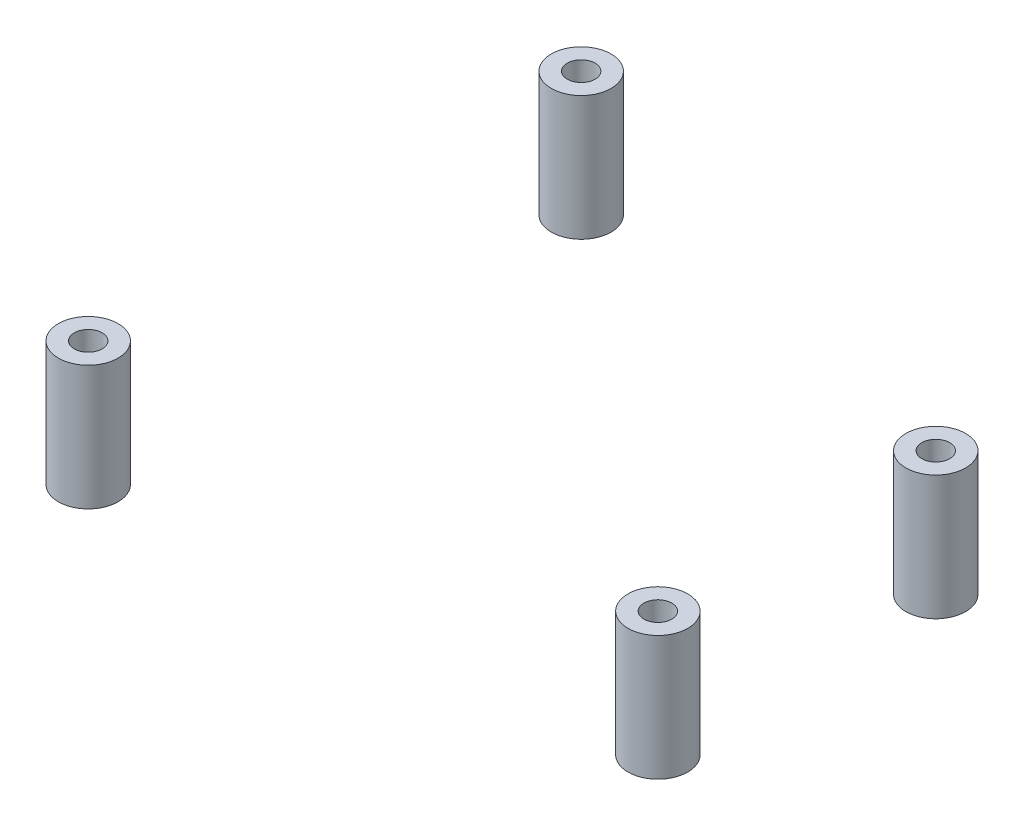
ISO-10303-21;
HEADER;
FILE_DESCRIPTION(('STEP AP214'),'2;1');
FILE_NAME('part.step','',(''),(''),'','','');
FILE_SCHEMA(('AUTOMOTIVE_DESIGN { 1 0 10303 214 1 1 1 1 }'));
ENDSEC;
DATA;
#1=APPLICATION_CONTEXT('core data for automotive mechanical design processes');
#2=APPLICATION_PROTOCOL_DEFINITION('international standard','automotive_design',2000,#1);
#3=PRODUCT_CONTEXT('',#1,'mechanical');
#4=PRODUCT('Part','Part','',(#3));
#5=PRODUCT_RELATED_PRODUCT_CATEGORY('part','',(#4));
#6=PRODUCT_DEFINITION_FORMATION('','',#4);
#7=PRODUCT_DEFINITION_CONTEXT('part definition',#1,'design');
#8=PRODUCT_DEFINITION('design','',#6,#7);
#9=PRODUCT_DEFINITION_SHAPE('','',#8);
#10=(LENGTH_UNIT() NAMED_UNIT(*) SI_UNIT(.MILLI.,.METRE.));
#11=(NAMED_UNIT(*) PLANE_ANGLE_UNIT() SI_UNIT($,.RADIAN.));
#12=(NAMED_UNIT(*) SI_UNIT($,.STERADIAN.) SOLID_ANGLE_UNIT());
#13=UNCERTAINTY_MEASURE_WITH_UNIT(LENGTH_MEASURE(1.E-05),#10,'distance_accuracy_value','');
#14=(GEOMETRIC_REPRESENTATION_CONTEXT(3) GLOBAL_UNCERTAINTY_ASSIGNED_CONTEXT((#13)) GLOBAL_UNIT_ASSIGNED_CONTEXT((#10,
#11,#12)) REPRESENTATION_CONTEXT('',''));
#15=CARTESIAN_POINT('',(0.,0.,0.));
#16=DIRECTION('',(0.,0.,1.));
#17=DIRECTION('',(1.,0.,0.));
#18=AXIS2_PLACEMENT_3D('',#15,#16,#17);
#19=CARTESIAN_POINT('',(0.,0.,0.));
#20=DIRECTION('',(0.,1.,0.));
#21=DIRECTION('',(0.,0.,1.));
#22=AXIS2_PLACEMENT_3D('',#19,#20,#21);
#23=PLANE('',#22);
#24=CARTESIAN_POINT('',(-10.9621033606898,0.,-13.3891794458076));
#25=DIRECTION('',(0.,1.,0.));
#26=DIRECTION('',(0.,0.,1.));
#27=AXIS2_PLACEMENT_3D('',#24,#25,#26);
#28=CIRCLE('',#27,3.);
#29=CARTESIAN_POINT('',(-10.9621033606898,0.,-10.3891794458076));
#30=VERTEX_POINT('',#29);
#31=EDGE_CURVE('E12',#30,#30,#28,.T.);
#32=ORIENTED_EDGE('',*,*,#31,.F.);
#33=EDGE_LOOP('',(#32));
#34=FACE_BOUND('',#33,.T.);
#35=ADVANCED_FACE('F84',(#34),#23,.F.);
#36=CARTESIAN_POINT('',(-10.9621033606898,12.5,-13.3891794458076));
#37=DIRECTION('',(0.,-1.,0.));
#38=DIRECTION('',(0.,0.,-1.));
#39=AXIS2_PLACEMENT_3D('',#36,#37,#38);
#40=CYLINDRICAL_SURFACE('',#39,3.);
#41=ORIENTED_EDGE('',*,*,#31,.T.);
#42=EDGE_LOOP('',(#41));
#43=FACE_BOUND('',#42,.T.);
#44=CARTESIAN_POINT('',(-10.9621033606898,12.5,-13.3891794458076));
#45=DIRECTION('',(0.,1.,0.));
#46=DIRECTION('',(0.,0.,1.));
#47=AXIS2_PLACEMENT_3D('',#44,#45,#46);
#48=CIRCLE('',#47,3.);
#49=CARTESIAN_POINT('',(-10.9621033606898,12.5,-10.3891794458076));
#50=VERTEX_POINT('',#49);
#51=EDGE_CURVE('E88',#50,#50,#48,.T.);
#52=ORIENTED_EDGE('',*,*,#51,.F.);
#53=EDGE_LOOP('',(#52));
#54=FACE_BOUND('',#53,.T.);
#55=ADVANCED_FACE('F113',(#43,#54),#40,.T.);
#56=CARTESIAN_POINT('',(0.,12.5,0.));
#57=DIRECTION('',(0.,1.,0.));
#58=DIRECTION('',(0.,0.,1.));
#59=AXIS2_PLACEMENT_3D('',#56,#57,#58);
#60=PLANE('',#59);
#61=CARTESIAN_POINT('',(-10.9621033606898,12.5,-13.3891794458076));
#62=DIRECTION('',(0.,1.,0.));
#63=DIRECTION('',(0.,0.,1.));
#64=AXIS2_PLACEMENT_3D('',#61,#62,#63);
#65=CIRCLE('',#64,1.4);
#66=CARTESIAN_POINT('',(-10.9621033606898,12.5,-11.9891794458076));
#67=VERTEX_POINT('',#66);
#68=EDGE_CURVE('E97',#67,#67,#65,.T.);
#69=ORIENTED_EDGE('',*,*,#68,.F.);
#70=EDGE_LOOP('',(#69));
#71=FACE_BOUND('',#70,.T.);
#72=ORIENTED_EDGE('',*,*,#51,.T.);
#73=EDGE_LOOP('',(#72));
#74=FACE_BOUND('',#73,.T.);
#75=ADVANCED_FACE('F86',(#71,#74),#60,.T.);
#76=CARTESIAN_POINT('',(-10.9621033606898,2.5,-13.3891794458076));
#77=DIRECTION('',(0.,1.,0.));
#78=DIRECTION('',(0.,0.,1.));
#79=AXIS2_PLACEMENT_3D('',#76,#77,#78);
#80=CYLINDRICAL_SURFACE('',#79,1.4);
#81=CARTESIAN_POINT('',(-10.9621033606898,2.5,-13.3891794458076));
#82=DIRECTION('',(0.,1.,0.));
#83=DIRECTION('',(0.,0.,1.));
#84=AXIS2_PLACEMENT_3D('',#81,#82,#83);
#85=CIRCLE('',#84,1.4);
#86=CARTESIAN_POINT('',(-10.9621033606898,2.5,-11.9891794458076));
#87=VERTEX_POINT('',#86);
#88=EDGE_CURVE('E95',#87,#87,#85,.T.);
#89=ORIENTED_EDGE('',*,*,#88,.F.);
#90=EDGE_LOOP('',(#89));
#91=FACE_BOUND('',#90,.T.);
#92=ORIENTED_EDGE('',*,*,#68,.T.);
#93=EDGE_LOOP('',(#92));
#94=FACE_BOUND('',#93,.T.);
#95=ADVANCED_FACE('F105',(#91,#94),#80,.F.);
#96=CARTESIAN_POINT('',(-10.9621033606898,2.5,-13.3891794458076));
#97=DIRECTION('',(0.,1.,0.));
#98=DIRECTION('',(0.,0.,1.));
#99=AXIS2_PLACEMENT_3D('',#96,#97,#98);
#100=PLANE('',#99);
#101=ORIENTED_EDGE('',*,*,#88,.T.);
#102=EDGE_LOOP('',(#101));
#103=FACE_BOUND('',#102,.T.);
#104=ADVANCED_FACE('F103',(#103),#100,.T.);
#105=CLOSED_SHELL('',(#35,#55,#75,#95,#104));
#106=MANIFOLD_SOLID_BREP('B2',#105);
#107=CARTESIAN_POINT('',(0.,0.,0.));
#108=DIRECTION('',(0.,1.,0.));
#109=DIRECTION('',(0.,0.,1.));
#110=AXIS2_PLACEMENT_3D('',#107,#108,#109);
#111=PLANE('',#110);
#112=CARTESIAN_POINT('',(39.8378966393102,0.,29.7108205541924));
#113=DIRECTION('',(0.,1.,0.));
#114=DIRECTION('',(0.,0.,1.));
#115=AXIS2_PLACEMENT_3D('',#112,#113,#114);
#116=CIRCLE('',#115,3.);
#117=CARTESIAN_POINT('',(39.8378966393102,0.,32.7108205541924));
#118=VERTEX_POINT('',#117);
#119=EDGE_CURVE('E83',#118,#118,#116,.T.);
#120=ORIENTED_EDGE('',*,*,#119,.F.);
#121=EDGE_LOOP('',(#120));
#122=FACE_BOUND('',#121,.T.);
#123=ADVANCED_FACE('F166',(#122),#111,.F.);
#124=CARTESIAN_POINT('',(39.8378966393102,12.5,29.7108205541924));
#125=DIRECTION('',(0.,-1.,0.));
#126=DIRECTION('',(0.,0.,-1.));
#127=AXIS2_PLACEMENT_3D('',#124,#125,#126);
#128=CYLINDRICAL_SURFACE('',#127,3.);
#129=ORIENTED_EDGE('',*,*,#119,.T.);
#130=EDGE_LOOP('',(#129));
#131=FACE_BOUND('',#130,.T.);
#132=CARTESIAN_POINT('',(39.8378966393102,12.5,29.7108205541924));
#133=DIRECTION('',(0.,1.,0.));
#134=DIRECTION('',(0.,0.,1.));
#135=AXIS2_PLACEMENT_3D('',#132,#133,#134);
#136=CIRCLE('',#135,3.);
#137=CARTESIAN_POINT('',(39.8378966393102,12.5,32.7108205541924));
#138=VERTEX_POINT('',#137);
#139=EDGE_CURVE('E170',#138,#138,#136,.T.);
#140=ORIENTED_EDGE('',*,*,#139,.F.);
#141=EDGE_LOOP('',(#140));
#142=FACE_BOUND('',#141,.T.);
#143=ADVANCED_FACE('F189',(#131,#142),#128,.T.);
#144=CARTESIAN_POINT('',(0.,12.5,0.));
#145=DIRECTION('',(0.,1.,0.));
#146=DIRECTION('',(0.,0.,1.));
#147=AXIS2_PLACEMENT_3D('',#144,#145,#146);
#148=PLANE('',#147);
#149=CARTESIAN_POINT('',(39.8378966393102,12.5,29.7108205541924));
#150=DIRECTION('',(0.,1.,0.));
#151=DIRECTION('',(0.,0.,1.));
#152=AXIS2_PLACEMENT_3D('',#149,#150,#151);
#153=CIRCLE('',#152,1.4);
#154=CARTESIAN_POINT('',(39.8378966393102,12.5,31.1108205541924));
#155=VERTEX_POINT('',#154);
#156=EDGE_CURVE('E177',#155,#155,#153,.T.);
#157=ORIENTED_EDGE('',*,*,#156,.F.);
#158=EDGE_LOOP('',(#157));
#159=FACE_BOUND('',#158,.T.);
#160=ORIENTED_EDGE('',*,*,#139,.T.);
#161=EDGE_LOOP('',(#160));
#162=FACE_BOUND('',#161,.T.);
#163=ADVANCED_FACE('F168',(#159,#162),#148,.T.);
#164=CARTESIAN_POINT('',(39.8378966393102,2.5,29.7108205541924));
#165=DIRECTION('',(0.,1.,0.));
#166=DIRECTION('',(0.,0.,1.));
#167=AXIS2_PLACEMENT_3D('',#164,#165,#166);
#168=CYLINDRICAL_SURFACE('',#167,1.4);
#169=CARTESIAN_POINT('',(39.8378966393102,2.5,29.7108205541924));
#170=DIRECTION('',(0.,1.,0.));
#171=DIRECTION('',(0.,0.,1.));
#172=AXIS2_PLACEMENT_3D('',#169,#170,#171);
#173=CIRCLE('',#172,1.4);
#174=CARTESIAN_POINT('',(39.8378966393102,2.5,31.1108205541924));
#175=VERTEX_POINT('',#174);
#176=EDGE_CURVE('E179',#175,#175,#173,.T.);
#177=ORIENTED_EDGE('',*,*,#176,.F.);
#178=EDGE_LOOP('',(#177));
#179=FACE_BOUND('',#178,.T.);
#180=ORIENTED_EDGE('',*,*,#156,.T.);
#181=EDGE_LOOP('',(#180));
#182=FACE_BOUND('',#181,.T.);
#183=ADVANCED_FACE('F185',(#179,#182),#168,.F.);
#184=CARTESIAN_POINT('',(39.8378966393102,2.5,29.7108205541924));
#185=DIRECTION('',(0.,1.,0.));
#186=DIRECTION('',(0.,0.,1.));
#187=AXIS2_PLACEMENT_3D('',#184,#185,#186);
#188=PLANE('',#187);
#189=ORIENTED_EDGE('',*,*,#176,.T.);
#190=EDGE_LOOP('',(#189));
#191=FACE_BOUND('',#190,.T.);
#192=ADVANCED_FACE('F199',(#191),#188,.T.);
#193=CLOSED_SHELL('',(#123,#143,#163,#183,#192));
#194=MANIFOLD_SOLID_BREP('B7',#193);
#195=CARTESIAN_POINT('',(0.,0.,0.));
#196=DIRECTION('',(0.,1.,0.));
#197=DIRECTION('',(0.,0.,1.));
#198=AXIS2_PLACEMENT_3D('',#195,#196,#197);
#199=PLANE('',#198);
#200=CARTESIAN_POINT('',(39.8378966393102,0.,1.81082055419243));
#201=DIRECTION('',(0.,1.,0.));
#202=DIRECTION('',(0.,0.,1.));
#203=AXIS2_PLACEMENT_3D('',#200,#201,#202);
#204=CIRCLE('',#203,3.);
#205=CARTESIAN_POINT('',(39.8378966393102,0.,4.81082055419244));
#206=VERTEX_POINT('',#205);
#207=EDGE_CURVE('E165',#206,#206,#204,.T.);
#208=ORIENTED_EDGE('',*,*,#207,.F.);
#209=EDGE_LOOP('',(#208));
#210=FACE_BOUND('',#209,.T.);
#211=ADVANCED_FACE('F247',(#210),#199,.F.);
#212=CARTESIAN_POINT('',(39.8378966393102,12.5,1.81082055419243));
#213=DIRECTION('',(0.,-1.,0.));
#214=DIRECTION('',(0.,0.,-1.));
#215=AXIS2_PLACEMENT_3D('',#212,#213,#214);
#216=CYLINDRICAL_SURFACE('',#215,3.);
#217=ORIENTED_EDGE('',*,*,#207,.T.);
#218=EDGE_LOOP('',(#217));
#219=FACE_BOUND('',#218,.T.);
#220=CARTESIAN_POINT('',(39.8378966393102,12.5,1.81082055419243));
#221=DIRECTION('',(0.,1.,0.));
#222=DIRECTION('',(0.,0.,1.));
#223=AXIS2_PLACEMENT_3D('',#220,#221,#222);
#224=CIRCLE('',#223,3.);
#225=CARTESIAN_POINT('',(39.8378966393102,12.5,4.81082055419244));
#226=VERTEX_POINT('',#225);
#227=EDGE_CURVE('E251',#226,#226,#224,.T.);
#228=ORIENTED_EDGE('',*,*,#227,.F.);
#229=EDGE_LOOP('',(#228));
#230=FACE_BOUND('',#229,.T.);
#231=ADVANCED_FACE('F270',(#219,#230),#216,.T.);
#232=CARTESIAN_POINT('',(0.,12.5,0.));
#233=DIRECTION('',(0.,1.,0.));
#234=DIRECTION('',(0.,0.,1.));
#235=AXIS2_PLACEMENT_3D('',#232,#233,#234);
#236=PLANE('',#235);
#237=CARTESIAN_POINT('',(39.8378966393102,12.5,1.81082055419243));
#238=DIRECTION('',(0.,1.,0.));
#239=DIRECTION('',(0.,0.,1.));
#240=AXIS2_PLACEMENT_3D('',#237,#238,#239);
#241=CIRCLE('',#240,1.4);
#242=CARTESIAN_POINT('',(39.8378966393102,12.5,3.21082055419243));
#243=VERTEX_POINT('',#242);
#244=EDGE_CURVE('E258',#243,#243,#241,.T.);
#245=ORIENTED_EDGE('',*,*,#244,.F.);
#246=EDGE_LOOP('',(#245));
#247=FACE_BOUND('',#246,.T.);
#248=ORIENTED_EDGE('',*,*,#227,.T.);
#249=EDGE_LOOP('',(#248));
#250=FACE_BOUND('',#249,.T.);
#251=ADVANCED_FACE('F249',(#247,#250),#236,.T.);
#252=CARTESIAN_POINT('',(39.8378966393102,2.5,1.81082055419243));
#253=DIRECTION('',(0.,1.,0.));
#254=DIRECTION('',(0.,0.,1.));
#255=AXIS2_PLACEMENT_3D('',#252,#253,#254);
#256=CYLINDRICAL_SURFACE('',#255,1.4);
#257=CARTESIAN_POINT('',(39.8378966393102,2.5,1.81082055419243));
#258=DIRECTION('',(0.,1.,0.));
#259=DIRECTION('',(0.,0.,1.));
#260=AXIS2_PLACEMENT_3D('',#257,#258,#259);
#261=CIRCLE('',#260,1.4);
#262=CARTESIAN_POINT('',(39.8378966393102,2.5,3.21082055419243));
#263=VERTEX_POINT('',#262);
#264=EDGE_CURVE('E260',#263,#263,#261,.T.);
#265=ORIENTED_EDGE('',*,*,#264,.F.);
#266=EDGE_LOOP('',(#265));
#267=FACE_BOUND('',#266,.T.);
#268=ORIENTED_EDGE('',*,*,#244,.T.);
#269=EDGE_LOOP('',(#268));
#270=FACE_BOUND('',#269,.T.);
#271=ADVANCED_FACE('F266',(#267,#270),#256,.F.);
#272=CARTESIAN_POINT('',(39.8378966393102,2.5,1.81082055419243));
#273=DIRECTION('',(0.,1.,0.));
#274=DIRECTION('',(0.,0.,1.));
#275=AXIS2_PLACEMENT_3D('',#272,#273,#274);
#276=PLANE('',#275);
#277=ORIENTED_EDGE('',*,*,#264,.T.);
#278=EDGE_LOOP('',(#277));
#279=FACE_BOUND('',#278,.T.);
#280=ADVANCED_FACE('F280',(#279),#276,.T.);
#281=CLOSED_SHELL('',(#211,#231,#251,#271,#280));
#282=MANIFOLD_SOLID_BREP('B78',#281);
#283=CARTESIAN_POINT('',(0.,0.,0.));
#284=DIRECTION('',(0.,1.,0.));
#285=DIRECTION('',(0.,0.,1.));
#286=AXIS2_PLACEMENT_3D('',#283,#284,#285);
#287=PLANE('',#286);
#288=CARTESIAN_POINT('',(-12.2621033606898,0.,34.8108205541924));
#289=DIRECTION('',(0.,1.,0.));
#290=DIRECTION('',(0.,0.,1.));
#291=AXIS2_PLACEMENT_3D('',#288,#289,#290);
#292=CIRCLE('',#291,3.);
#293=CARTESIAN_POINT('',(-12.2621033606898,0.,37.8108205541924));
#294=VERTEX_POINT('',#293);
#295=EDGE_CURVE('E325',#294,#294,#292,.T.);
#296=ORIENTED_EDGE('',*,*,#295,.F.);
#297=EDGE_LOOP('',(#296));
#298=FACE_BOUND('',#297,.T.);
#299=ADVANCED_FACE('F321',(#298),#287,.F.);
#300=CARTESIAN_POINT('',(-12.2621033606898,12.5,34.8108205541924));
#301=DIRECTION('',(0.,-1.,0.));
#302=DIRECTION('',(0.,0.,-1.));
#303=AXIS2_PLACEMENT_3D('',#300,#301,#302);
#304=CYLINDRICAL_SURFACE('',#303,3.);
#305=ORIENTED_EDGE('',*,*,#295,.T.);
#306=EDGE_LOOP('',(#305));
#307=FACE_BOUND('',#306,.T.);
#308=CARTESIAN_POINT('',(-12.2621033606898,12.5,34.8108205541924));
#309=DIRECTION('',(0.,1.,0.));
#310=DIRECTION('',(0.,0.,1.));
#311=AXIS2_PLACEMENT_3D('',#308,#309,#310);
#312=CIRCLE('',#311,3.);
#313=CARTESIAN_POINT('',(-12.2621033606898,12.5,37.8108205541924));
#314=VERTEX_POINT('',#313);
#315=EDGE_CURVE('E246',#314,#314,#312,.T.);
#316=ORIENTED_EDGE('',*,*,#315,.F.);
#317=EDGE_LOOP('',(#316));
#318=FACE_BOUND('',#317,.T.);
#319=ADVANCED_FACE('F323',(#307,#318),#304,.T.);
#320=CARTESIAN_POINT('',(0.,12.5,0.));
#321=DIRECTION('',(0.,1.,0.));
#322=DIRECTION('',(0.,0.,1.));
#323=AXIS2_PLACEMENT_3D('',#320,#321,#322);
#324=PLANE('',#323);
#325=CARTESIAN_POINT('',(-12.2621033606898,12.5,34.8108205541924));
#326=DIRECTION('',(0.,1.,0.));
#327=DIRECTION('',(0.,0.,1.));
#328=AXIS2_PLACEMENT_3D('',#325,#326,#327);
#329=CIRCLE('',#328,1.4);
#330=CARTESIAN_POINT('',(-12.2621033606898,12.5,36.2108205541924));
#331=VERTEX_POINT('',#330);
#332=EDGE_CURVE('E332',#331,#331,#329,.T.);
#333=ORIENTED_EDGE('',*,*,#332,.F.);
#334=EDGE_LOOP('',(#333));
#335=FACE_BOUND('',#334,.T.);
#336=ORIENTED_EDGE('',*,*,#315,.T.);
#337=EDGE_LOOP('',(#336));
#338=FACE_BOUND('',#337,.T.);
#339=ADVANCED_FACE('F342',(#335,#338),#324,.T.);
#340=CARTESIAN_POINT('',(-12.2621033606898,2.5,34.8108205541924));
#341=DIRECTION('',(0.,1.,0.));
#342=DIRECTION('',(0.,0.,1.));
#343=AXIS2_PLACEMENT_3D('',#340,#341,#342);
#344=CYLINDRICAL_SURFACE('',#343,1.4);
#345=CARTESIAN_POINT('',(-12.2621033606898,2.5,34.8108205541924));
#346=DIRECTION('',(0.,1.,0.));
#347=DIRECTION('',(0.,0.,1.));
#348=AXIS2_PLACEMENT_3D('',#345,#346,#347);
#349=CIRCLE('',#348,1.4);
#350=CARTESIAN_POINT('',(-12.2621033606898,2.5,36.2108205541924));
#351=VERTEX_POINT('',#350);
#352=EDGE_CURVE('E334',#351,#351,#349,.T.);
#353=ORIENTED_EDGE('',*,*,#352,.F.);
#354=EDGE_LOOP('',(#353));
#355=FACE_BOUND('',#354,.T.);
#356=ORIENTED_EDGE('',*,*,#332,.T.);
#357=EDGE_LOOP('',(#356));
#358=FACE_BOUND('',#357,.T.);
#359=ADVANCED_FACE('F340',(#355,#358),#344,.F.);
#360=CARTESIAN_POINT('',(-12.2621033606898,2.5,34.8108205541924));
#361=DIRECTION('',(0.,1.,0.));
#362=DIRECTION('',(0.,0.,1.));
#363=AXIS2_PLACEMENT_3D('',#360,#361,#362);
#364=PLANE('',#363);
#365=ORIENTED_EDGE('',*,*,#352,.T.);
#366=EDGE_LOOP('',(#365));
#367=FACE_BOUND('',#366,.T.);
#368=ADVANCED_FACE('F349',(#367),#364,.T.);
#369=CLOSED_SHELL('',(#299,#319,#339,#359,#368));
#370=MANIFOLD_SOLID_BREP('B160',#369);
#371=ADVANCED_BREP_SHAPE_REPRESENTATION('',(#18,#106,#194,#282,#370),#14);
#372=SHAPE_DEFINITION_REPRESENTATION(#9,#371);
ENDSEC;
END-ISO-10303-21;
